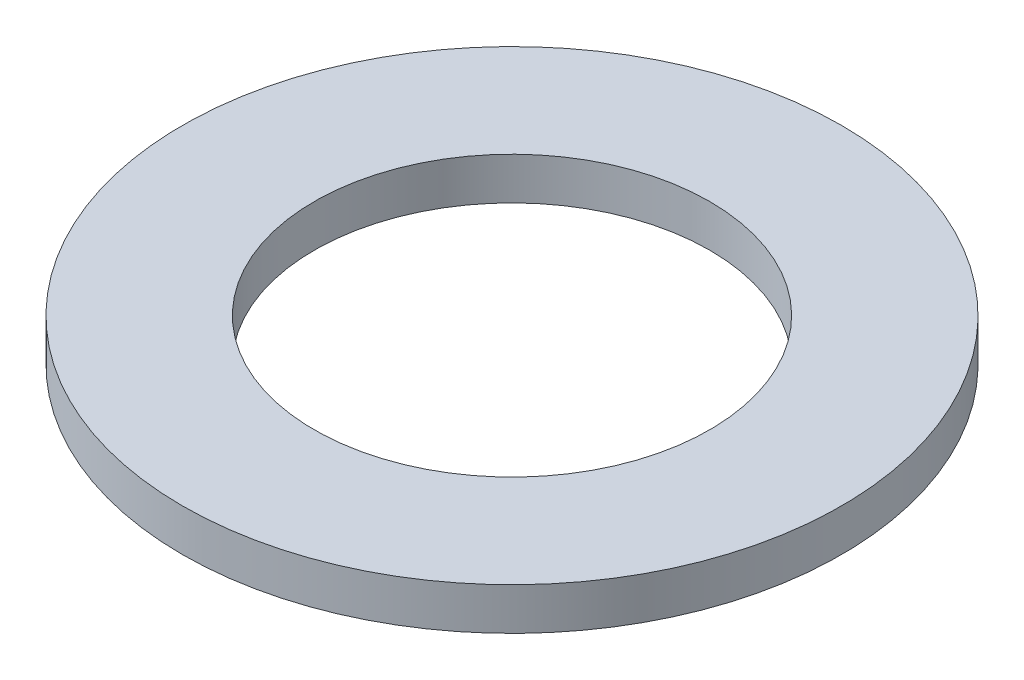
ISO-10303-21;
HEADER;
FILE_DESCRIPTION(('STEP AP214'),'2;1');
FILE_NAME('part.step','',(''),(''),'','','');
FILE_SCHEMA(('AUTOMOTIVE_DESIGN { 1 0 10303 214 1 1 1 1 }'));
ENDSEC;
DATA;
#1=APPLICATION_CONTEXT('core data for automotive mechanical design processes');
#2=APPLICATION_PROTOCOL_DEFINITION('international standard','automotive_design',2000,#1);
#3=PRODUCT_CONTEXT('',#1,'mechanical');
#4=PRODUCT('Part','Part','',(#3));
#5=PRODUCT_RELATED_PRODUCT_CATEGORY('part','',(#4));
#6=PRODUCT_DEFINITION_FORMATION('','',#4);
#7=PRODUCT_DEFINITION_CONTEXT('part definition',#1,'design');
#8=PRODUCT_DEFINITION('design','',#6,#7);
#9=PRODUCT_DEFINITION_SHAPE('','',#8);
#10=(LENGTH_UNIT() NAMED_UNIT(*) SI_UNIT(.MILLI.,.METRE.));
#11=(NAMED_UNIT(*) PLANE_ANGLE_UNIT() SI_UNIT($,.RADIAN.));
#12=(NAMED_UNIT(*) SI_UNIT($,.STERADIAN.) SOLID_ANGLE_UNIT());
#13=UNCERTAINTY_MEASURE_WITH_UNIT(LENGTH_MEASURE(1.E-05),#10,'distance_accuracy_value','');
#14=(GEOMETRIC_REPRESENTATION_CONTEXT(3) GLOBAL_UNCERTAINTY_ASSIGNED_CONTEXT((#13)) GLOBAL_UNIT_ASSIGNED_CONTEXT((#10,
#11,#12)) REPRESENTATION_CONTEXT('',''));
#15=CARTESIAN_POINT('',(0.,0.,0.));
#16=DIRECTION('',(0.,0.,1.));
#17=DIRECTION('',(1.,0.,0.));
#18=AXIS2_PLACEMENT_3D('',#15,#16,#17);
#19=CARTESIAN_POINT('',(0.,0.,0.));
#20=DIRECTION('',(0.,1.,0.));
#21=DIRECTION('',(0.,0.,1.));
#22=AXIS2_PLACEMENT_3D('',#19,#20,#21);
#23=PLANE('',#22);
#24=CARTESIAN_POINT('',(0.,0.,0.));
#25=DIRECTION('',(0.,-1.,0.));
#26=DIRECTION('',(0.,0.,-1.));
#27=AXIS2_PLACEMENT_3D('',#24,#25,#26);
#28=CIRCLE('',#27,9.525);
#29=CARTESIAN_POINT('',(0.,0.,-9.525));
#30=VERTEX_POINT('',#29);
#31=EDGE_CURVE('E30',#30,#30,#28,.F.);
#32=ORIENTED_EDGE('',*,*,#31,.T.);
#33=EDGE_LOOP('',(#32));
#34=FACE_BOUND('',#33,.T.);
#35=CARTESIAN_POINT('',(0.,0.,0.));
#36=DIRECTION('',(0.,-1.,0.));
#37=DIRECTION('',(0.,0.,-1.));
#38=AXIS2_PLACEMENT_3D('',#35,#36,#37);
#39=CIRCLE('',#38,15.875);
#40=CARTESIAN_POINT('',(0.,0.,-15.875));
#41=VERTEX_POINT('',#40);
#42=EDGE_CURVE('E17',#41,#41,#39,.F.);
#43=ORIENTED_EDGE('',*,*,#42,.F.);
#44=EDGE_LOOP('',(#43));
#45=FACE_BOUND('',#44,.T.);
#46=ADVANCED_FACE('F14',(#34,#45),#23,.F.);
#47=CARTESIAN_POINT('',(0.,2.032,0.));
#48=DIRECTION('',(0.,-1.,0.));
#49=DIRECTION('',(0.,0.,-1.));
#50=AXIS2_PLACEMENT_3D('',#47,#48,#49);
#51=CYLINDRICAL_SURFACE('',#50,15.875);
#52=ORIENTED_EDGE('',*,*,#42,.T.);
#53=EDGE_LOOP('',(#52));
#54=FACE_BOUND('',#53,.T.);
#55=CARTESIAN_POINT('',(0.,2.032,0.));
#56=DIRECTION('',(0.,-1.,0.));
#57=DIRECTION('',(0.,0.,-1.));
#58=AXIS2_PLACEMENT_3D('',#55,#56,#57);
#59=CIRCLE('',#58,15.875);
#60=CARTESIAN_POINT('',(0.,2.032,-15.875));
#61=VERTEX_POINT('',#60);
#62=EDGE_CURVE('E22',#61,#61,#59,.F.);
#63=ORIENTED_EDGE('',*,*,#62,.F.);
#64=EDGE_LOOP('',(#63));
#65=FACE_BOUND('',#64,.T.);
#66=ADVANCED_FACE('F39',(#54,#65),#51,.T.);
#67=CARTESIAN_POINT('',(0.,2.032,0.));
#68=DIRECTION('',(0.,-1.,0.));
#69=DIRECTION('',(0.,0.,-1.));
#70=AXIS2_PLACEMENT_3D('',#67,#68,#69);
#71=CYLINDRICAL_SURFACE('',#70,9.525);
#72=CARTESIAN_POINT('',(0.,2.032,0.));
#73=DIRECTION('',(0.,-1.,0.));
#74=DIRECTION('',(0.,0.,-1.));
#75=AXIS2_PLACEMENT_3D('',#72,#73,#74);
#76=CIRCLE('',#75,9.525);
#77=CARTESIAN_POINT('',(0.,2.032,-9.525));
#78=VERTEX_POINT('',#77);
#79=EDGE_CURVE('E10',#78,#78,#76,.T.);
#80=ORIENTED_EDGE('',*,*,#79,.F.);
#81=EDGE_LOOP('',(#80));
#82=FACE_BOUND('',#81,.T.);
#83=ORIENTED_EDGE('',*,*,#31,.F.);
#84=EDGE_LOOP('',(#83));
#85=FACE_BOUND('',#84,.T.);
#86=ADVANCED_FACE('F48',(#82,#85),#71,.F.);
#87=CARTESIAN_POINT('',(0.,2.032,0.));
#88=DIRECTION('',(0.,1.,0.));
#89=DIRECTION('',(0.,0.,1.));
#90=AXIS2_PLACEMENT_3D('',#87,#88,#89);
#91=PLANE('',#90);
#92=ORIENTED_EDGE('',*,*,#79,.T.);
#93=EDGE_LOOP('',(#92));
#94=FACE_BOUND('',#93,.T.);
#95=ORIENTED_EDGE('',*,*,#62,.T.);
#96=EDGE_LOOP('',(#95));
#97=FACE_BOUND('',#96,.T.);
#98=ADVANCED_FACE('F49',(#94,#97),#91,.T.);
#99=CLOSED_SHELL('',(#46,#66,#86,#98));
#100=MANIFOLD_SOLID_BREP('B1',#99);
#101=ADVANCED_BREP_SHAPE_REPRESENTATION('',(#18,#100),#14);
#102=SHAPE_DEFINITION_REPRESENTATION(#9,#101);
ENDSEC;
END-ISO-10303-21;
